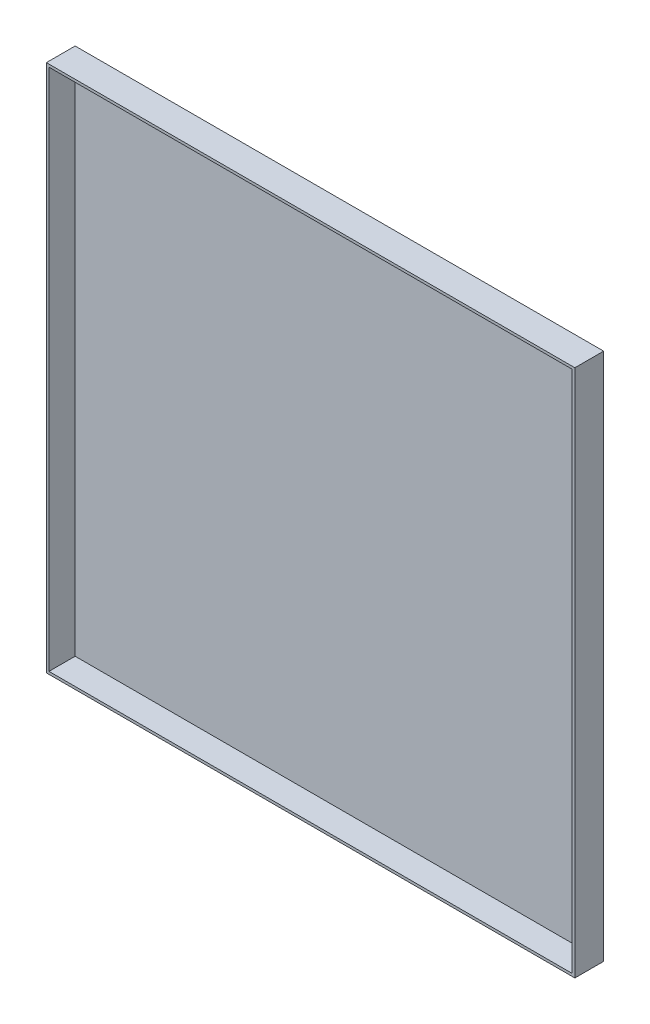
ISO-10303-21;
HEADER;
FILE_DESCRIPTION(('STEP AP214'),'2;1');
FILE_NAME('part.step','',(''),(''),'','','');
FILE_SCHEMA(('AUTOMOTIVE_DESIGN { 1 0 10303 214 1 1 1 1 }'));
ENDSEC;
DATA;
#1=APPLICATION_CONTEXT('core data for automotive mechanical design processes');
#2=APPLICATION_PROTOCOL_DEFINITION('international standard','automotive_design',2000,#1);
#3=PRODUCT_CONTEXT('',#1,'mechanical');
#4=PRODUCT('Part','Part','',(#3));
#5=PRODUCT_RELATED_PRODUCT_CATEGORY('part','',(#4));
#6=PRODUCT_DEFINITION_FORMATION('','',#4);
#7=PRODUCT_DEFINITION_CONTEXT('part definition',#1,'design');
#8=PRODUCT_DEFINITION('design','',#6,#7);
#9=PRODUCT_DEFINITION_SHAPE('','',#8);
#10=(LENGTH_UNIT() NAMED_UNIT(*) SI_UNIT(.MILLI.,.METRE.));
#11=(NAMED_UNIT(*) PLANE_ANGLE_UNIT() SI_UNIT($,.RADIAN.));
#12=(NAMED_UNIT(*) SI_UNIT($,.STERADIAN.) SOLID_ANGLE_UNIT());
#13=UNCERTAINTY_MEASURE_WITH_UNIT(LENGTH_MEASURE(1.E-05),#10,'distance_accuracy_value','');
#14=(GEOMETRIC_REPRESENTATION_CONTEXT(3) GLOBAL_UNCERTAINTY_ASSIGNED_CONTEXT((#13)) GLOBAL_UNIT_ASSIGNED_CONTEXT((#10,
#11,#12)) REPRESENTATION_CONTEXT('',''));
#15=CARTESIAN_POINT('',(0.,0.,0.));
#16=DIRECTION('',(0.,0.,1.));
#17=DIRECTION('',(1.,0.,0.));
#18=AXIS2_PLACEMENT_3D('',#15,#16,#17);
#19=CARTESIAN_POINT('',(-14.9953059608642,189.571428571429,-11.));
#20=DIRECTION('',(-1.,0.,0.));
#21=DIRECTION('',(0.,-1.,0.));
#22=AXIS2_PLACEMENT_3D('',#19,#20,#21);
#23=PLANE('',#22);
#24=DIRECTION('',(0.,-1.,0.));
#25=VECTOR('',#24,1.);
#26=CARTESIAN_POINT('',(-14.9953059608642,189.571428571429,0.));
#27=LINE('',#26,#25);
#28=CARTESIAN_POINT('',(-14.9953059608642,189.571428571429,0.));
#29=VERTEX_POINT('',#28);
#30=CARTESIAN_POINT('',(-14.9953059608641,-12.4285714285714,0.));
#31=VERTEX_POINT('',#30);
#32=EDGE_CURVE('E165',#29,#31,#27,.T.);
#33=ORIENTED_EDGE('',*,*,#32,.F.);
#34=DIRECTION('',(0.,0.,1.));
#35=VECTOR('',#34,1.);
#36=CARTESIAN_POINT('',(-14.9953059608642,189.571428571429,-11.));
#37=LINE('',#36,#35);
#38=CARTESIAN_POINT('',(-14.9953059608642,189.571428571429,-11.));
#39=VERTEX_POINT('',#38);
#40=EDGE_CURVE('E11',#39,#29,#37,.T.);
#41=ORIENTED_EDGE('',*,*,#40,.F.);
#42=DIRECTION('',(0.,-1.,0.));
#43=VECTOR('',#42,1.);
#44=CARTESIAN_POINT('',(-14.9953059608642,189.571428571429,-11.));
#45=LINE('',#44,#43);
#46=CARTESIAN_POINT('',(-14.9953059608641,-12.4285714285714,-11.));
#47=VERTEX_POINT('',#46);
#48=EDGE_CURVE('E171',#39,#47,#45,.T.);
#49=ORIENTED_EDGE('',*,*,#48,.T.);
#50=DIRECTION('',(0.,0.,1.));
#51=VECTOR('',#50,1.);
#52=CARTESIAN_POINT('',(-14.9953059608641,-12.4285714285714,-11.));
#53=LINE('',#52,#51);
#54=EDGE_CURVE('E50',#47,#31,#53,.T.);
#55=ORIENTED_EDGE('',*,*,#54,.T.);
#56=EDGE_LOOP('',(#33,#41,#49,#55));
#57=FACE_BOUND('',#56,.T.);
#58=ADVANCED_FACE('F47',(#57),#23,.T.);
#59=CARTESIAN_POINT('',(-14.9953059608642,189.571428571429,-11.));
#60=DIRECTION('',(0.,1.,0.));
#61=DIRECTION('',(0.,0.,1.));
#62=AXIS2_PLACEMENT_3D('',#59,#60,#61);
#63=PLANE('',#62);
#64=DIRECTION('',(-1.,0.,0.));
#65=VECTOR('',#64,1.);
#66=CARTESIAN_POINT('',(-14.9953059608642,189.571428571429,0.));
#67=LINE('',#66,#65);
#68=CARTESIAN_POINT('',(187.004694039136,189.571428571429,0.));
#69=VERTEX_POINT('',#68);
#70=EDGE_CURVE('E175',#69,#29,#67,.T.);
#71=ORIENTED_EDGE('',*,*,#70,.F.);
#72=DIRECTION('',(0.,0.,1.));
#73=VECTOR('',#72,1.);
#74=CARTESIAN_POINT('',(187.004694039136,189.571428571429,-11.));
#75=LINE('',#74,#73);
#76=CARTESIAN_POINT('',(187.004694039136,189.571428571429,-11.));
#77=VERTEX_POINT('',#76);
#78=EDGE_CURVE('E56',#77,#69,#75,.T.);
#79=ORIENTED_EDGE('',*,*,#78,.F.);
#80=DIRECTION('',(-1.,0.,0.));
#81=VECTOR('',#80,1.);
#82=CARTESIAN_POINT('',(-14.9953059608642,189.571428571429,-11.));
#83=LINE('',#82,#81);
#84=EDGE_CURVE('E182',#77,#39,#83,.T.);
#85=ORIENTED_EDGE('',*,*,#84,.T.);
#86=ORIENTED_EDGE('',*,*,#40,.T.);
#87=EDGE_LOOP('',(#71,#79,#85,#86));
#88=FACE_BOUND('',#87,.T.);
#89=ADVANCED_FACE('F207',(#88),#63,.T.);
#90=CARTESIAN_POINT('',(187.004694039136,189.571428571429,-11.));
#91=DIRECTION('',(1.,0.,0.));
#92=DIRECTION('',(0.,0.,-1.));
#93=AXIS2_PLACEMENT_3D('',#90,#91,#92);
#94=PLANE('',#93);
#95=DIRECTION('',(0.,1.,0.));
#96=VECTOR('',#95,1.);
#97=CARTESIAN_POINT('',(187.004694039136,189.571428571429,0.));
#98=LINE('',#97,#96);
#99=CARTESIAN_POINT('',(187.004694039136,-12.4285714285714,0.));
#100=VERTEX_POINT('',#99);
#101=EDGE_CURVE('E192',#100,#69,#98,.T.);
#102=ORIENTED_EDGE('',*,*,#101,.F.);
#103=DIRECTION('',(0.,0.,1.));
#104=VECTOR('',#103,1.);
#105=CARTESIAN_POINT('',(187.004694039136,-12.4285714285714,-11.));
#106=LINE('',#105,#104);
#107=CARTESIAN_POINT('',(187.004694039136,-12.4285714285714,-11.));
#108=VERTEX_POINT('',#107);
#109=EDGE_CURVE('E200',#108,#100,#106,.T.);
#110=ORIENTED_EDGE('',*,*,#109,.F.);
#111=DIRECTION('',(0.,1.,0.));
#112=VECTOR('',#111,1.);
#113=CARTESIAN_POINT('',(187.004694039136,189.571428571429,-11.));
#114=LINE('',#113,#112);
#115=EDGE_CURVE('E178',#108,#77,#114,.T.);
#116=ORIENTED_EDGE('',*,*,#115,.T.);
#117=ORIENTED_EDGE('',*,*,#78,.T.);
#118=EDGE_LOOP('',(#102,#110,#116,#117));
#119=FACE_BOUND('',#118,.T.);
#120=ADVANCED_FACE('F211',(#119),#94,.T.);
#121=CARTESIAN_POINT('',(-14.9953059608641,-12.4285714285714,-11.));
#122=DIRECTION('',(0.,-1.,0.));
#123=DIRECTION('',(0.,0.,-1.));
#124=AXIS2_PLACEMENT_3D('',#121,#122,#123);
#125=PLANE('',#124);
#126=DIRECTION('',(1.,0.,0.));
#127=VECTOR('',#126,1.);
#128=CARTESIAN_POINT('',(-14.9953059608641,-12.4285714285714,0.));
#129=LINE('',#128,#127);
#130=EDGE_CURVE('E188',#31,#100,#129,.T.);
#131=ORIENTED_EDGE('',*,*,#130,.F.);
#132=ORIENTED_EDGE('',*,*,#54,.F.);
#133=DIRECTION('',(1.,0.,0.));
#134=VECTOR('',#133,1.);
#135=CARTESIAN_POINT('',(-14.9953059608641,-12.4285714285714,-11.));
#136=LINE('',#135,#134);
#137=EDGE_CURVE('E174',#47,#108,#136,.T.);
#138=ORIENTED_EDGE('',*,*,#137,.T.);
#139=ORIENTED_EDGE('',*,*,#109,.T.);
#140=EDGE_LOOP('',(#131,#132,#138,#139));
#141=FACE_BOUND('',#140,.T.);
#142=ADVANCED_FACE('F204',(#141),#125,.T.);
#143=CARTESIAN_POINT('',(0.,0.,-11.));
#144=DIRECTION('',(0.,0.,1.));
#145=DIRECTION('',(1.,0.,0.));
#146=AXIS2_PLACEMENT_3D('',#143,#144,#145);
#147=PLANE('',#146);
#148=ORIENTED_EDGE('',*,*,#48,.F.);
#149=ORIENTED_EDGE('',*,*,#84,.F.);
#150=ORIENTED_EDGE('',*,*,#115,.F.);
#151=ORIENTED_EDGE('',*,*,#137,.F.);
#152=EDGE_LOOP('',(#148,#149,#150,#151));
#153=FACE_BOUND('',#152,.T.);
#154=ADVANCED_FACE('F213',(#153),#147,.F.);
#155=CARTESIAN_POINT('',(0.,0.,0.));
#156=DIRECTION('',(0.,0.,1.));
#157=DIRECTION('',(1.,0.,0.));
#158=AXIS2_PLACEMENT_3D('',#155,#156,#157);
#159=PLANE('',#158);
#160=DIRECTION('',(0.,-1.,0.));
#161=VECTOR('',#160,1.);
#162=CARTESIAN_POINT('',(-13.9953059608642,188.571428571429,0.));
#163=LINE('',#162,#161);
#164=CARTESIAN_POINT('',(-13.9953059608642,188.571428571429,0.));
#165=VERTEX_POINT('',#164);
#166=CARTESIAN_POINT('',(-13.9953059608642,-11.4285714285714,0.));
#167=VERTEX_POINT('',#166);
#168=EDGE_CURVE('E64',#165,#167,#163,.T.);
#169=ORIENTED_EDGE('',*,*,#168,.F.);
#170=DIRECTION('',(-1.,0.,0.));
#171=VECTOR('',#170,1.);
#172=CARTESIAN_POINT('',(-13.9953059608642,188.571428571429,0.));
#173=LINE('',#172,#171);
#174=CARTESIAN_POINT('',(186.004694039136,188.571428571429,0.));
#175=VERTEX_POINT('',#174);
#176=EDGE_CURVE('E143',#175,#165,#173,.T.);
#177=ORIENTED_EDGE('',*,*,#176,.F.);
#178=DIRECTION('',(0.,1.,0.));
#179=VECTOR('',#178,1.);
#180=CARTESIAN_POINT('',(186.004694039136,188.571428571429,0.));
#181=LINE('',#180,#179);
#182=CARTESIAN_POINT('',(186.004694039136,-11.4285714285714,0.));
#183=VERTEX_POINT('',#182);
#184=EDGE_CURVE('E147',#183,#175,#181,.T.);
#185=ORIENTED_EDGE('',*,*,#184,.F.);
#186=DIRECTION('',(1.,0.,0.));
#187=VECTOR('',#186,1.);
#188=CARTESIAN_POINT('',(-13.9953059608642,-11.4285714285714,0.));
#189=LINE('',#188,#187);
#190=EDGE_CURVE('E156',#167,#183,#189,.T.);
#191=ORIENTED_EDGE('',*,*,#190,.F.);
#192=EDGE_LOOP('',(#169,#177,#185,#191));
#193=FACE_BOUND('',#192,.T.);
#194=ORIENTED_EDGE('',*,*,#32,.T.);
#195=ORIENTED_EDGE('',*,*,#130,.T.);
#196=ORIENTED_EDGE('',*,*,#101,.T.);
#197=ORIENTED_EDGE('',*,*,#70,.T.);
#198=EDGE_LOOP('',(#194,#195,#196,#197));
#199=FACE_BOUND('',#198,.T.);
#200=ADVANCED_FACE('F206',(#193,#199),#159,.T.);
#201=CARTESIAN_POINT('',(-13.9953059608642,188.571428571429,-10.));
#202=DIRECTION('',(-1.,0.,0.));
#203=DIRECTION('',(0.,-1.,0.));
#204=AXIS2_PLACEMENT_3D('',#201,#202,#203);
#205=PLANE('',#204);
#206=ORIENTED_EDGE('',*,*,#168,.T.);
#207=DIRECTION('',(0.,0.,1.));
#208=VECTOR('',#207,1.);
#209=CARTESIAN_POINT('',(-13.9953059608642,-11.4285714285714,-10.));
#210=LINE('',#209,#208);
#211=CARTESIAN_POINT('',(-13.9953059608642,-11.4285714285714,-10.));
#212=VERTEX_POINT('',#211);
#213=EDGE_CURVE('E118',#212,#167,#210,.T.);
#214=ORIENTED_EDGE('',*,*,#213,.F.);
#215=DIRECTION('',(0.,-1.,0.));
#216=VECTOR('',#215,1.);
#217=CARTESIAN_POINT('',(-13.9953059608642,188.571428571429,-10.));
#218=LINE('',#217,#216);
#219=CARTESIAN_POINT('',(-13.9953059608642,188.571428571429,-10.));
#220=VERTEX_POINT('',#219);
#221=EDGE_CURVE('E122',#220,#212,#218,.T.);
#222=ORIENTED_EDGE('',*,*,#221,.F.);
#223=DIRECTION('',(0.,0.,1.));
#224=VECTOR('',#223,1.);
#225=CARTESIAN_POINT('',(-13.9953059608642,188.571428571429,-10.));
#226=LINE('',#225,#224);
#227=EDGE_CURVE('E162',#220,#165,#226,.T.);
#228=ORIENTED_EDGE('',*,*,#227,.T.);
#229=EDGE_LOOP('',(#206,#214,#222,#228));
#230=FACE_BOUND('',#229,.T.);
#231=ADVANCED_FACE('F120',(#230),#205,.F.);
#232=CARTESIAN_POINT('',(-13.9953059608642,188.571428571429,-10.));
#233=DIRECTION('',(0.,1.,0.));
#234=DIRECTION('',(0.,0.,1.));
#235=AXIS2_PLACEMENT_3D('',#232,#233,#234);
#236=PLANE('',#235);
#237=ORIENTED_EDGE('',*,*,#176,.T.);
#238=ORIENTED_EDGE('',*,*,#227,.F.);
#239=DIRECTION('',(-1.,0.,0.));
#240=VECTOR('',#239,1.);
#241=CARTESIAN_POINT('',(-13.9953059608642,188.571428571429,-10.));
#242=LINE('',#241,#240);
#243=CARTESIAN_POINT('',(186.004694039136,188.571428571429,-10.));
#244=VERTEX_POINT('',#243);
#245=EDGE_CURVE('E129',#244,#220,#242,.T.);
#246=ORIENTED_EDGE('',*,*,#245,.F.);
#247=DIRECTION('',(0.,0.,1.));
#248=VECTOR('',#247,1.);
#249=CARTESIAN_POINT('',(186.004694039136,188.571428571429,-10.));
#250=LINE('',#249,#248);
#251=EDGE_CURVE('E166',#244,#175,#250,.T.);
#252=ORIENTED_EDGE('',*,*,#251,.T.);
#253=EDGE_LOOP('',(#237,#238,#246,#252));
#254=FACE_BOUND('',#253,.T.);
#255=ADVANCED_FACE('F264',(#254),#236,.F.);
#256=CARTESIAN_POINT('',(186.004694039136,188.571428571429,-10.));
#257=DIRECTION('',(1.,0.,0.));
#258=DIRECTION('',(0.,0.,-1.));
#259=AXIS2_PLACEMENT_3D('',#256,#257,#258);
#260=PLANE('',#259);
#261=ORIENTED_EDGE('',*,*,#184,.T.);
#262=ORIENTED_EDGE('',*,*,#251,.F.);
#263=DIRECTION('',(0.,1.,0.));
#264=VECTOR('',#263,1.);
#265=CARTESIAN_POINT('',(186.004694039136,188.571428571429,-10.));
#266=LINE('',#265,#264);
#267=CARTESIAN_POINT('',(186.004694039136,-11.4285714285714,-10.));
#268=VERTEX_POINT('',#267);
#269=EDGE_CURVE('E138',#268,#244,#266,.T.);
#270=ORIENTED_EDGE('',*,*,#269,.F.);
#271=DIRECTION('',(0.,0.,1.));
#272=VECTOR('',#271,1.);
#273=CARTESIAN_POINT('',(186.004694039136,-11.4285714285714,-10.));
#274=LINE('',#273,#272);
#275=EDGE_CURVE('E128',#268,#183,#274,.T.);
#276=ORIENTED_EDGE('',*,*,#275,.T.);
#277=EDGE_LOOP('',(#261,#262,#270,#276));
#278=FACE_BOUND('',#277,.T.);
#279=ADVANCED_FACE('F271',(#278),#260,.F.);
#280=CARTESIAN_POINT('',(-13.9953059608642,-11.4285714285714,-10.));
#281=DIRECTION('',(0.,-1.,0.));
#282=DIRECTION('',(0.,0.,-1.));
#283=AXIS2_PLACEMENT_3D('',#280,#281,#282);
#284=PLANE('',#283);
#285=ORIENTED_EDGE('',*,*,#190,.T.);
#286=ORIENTED_EDGE('',*,*,#275,.F.);
#287=DIRECTION('',(1.,0.,0.));
#288=VECTOR('',#287,1.);
#289=CARTESIAN_POINT('',(-13.9953059608642,-11.4285714285714,-10.));
#290=LINE('',#289,#288);
#291=EDGE_CURVE('E132',#212,#268,#290,.T.);
#292=ORIENTED_EDGE('',*,*,#291,.F.);
#293=ORIENTED_EDGE('',*,*,#213,.T.);
#294=EDGE_LOOP('',(#285,#286,#292,#293));
#295=FACE_BOUND('',#294,.T.);
#296=ADVANCED_FACE('F133',(#295),#284,.F.);
#297=CARTESIAN_POINT('',(0.,0.,-10.));
#298=DIRECTION('',(0.,0.,1.));
#299=DIRECTION('',(1.,0.,0.));
#300=AXIS2_PLACEMENT_3D('',#297,#298,#299);
#301=PLANE('',#300);
#302=ORIENTED_EDGE('',*,*,#221,.T.);
#303=ORIENTED_EDGE('',*,*,#291,.T.);
#304=ORIENTED_EDGE('',*,*,#269,.T.);
#305=ORIENTED_EDGE('',*,*,#245,.T.);
#306=EDGE_LOOP('',(#302,#303,#304,#305));
#307=FACE_BOUND('',#306,.T.);
#308=ADVANCED_FACE('F140',(#307),#301,.T.);
#309=CLOSED_SHELL('',(#58,#89,#120,#142,#154,#200,#231,#255,#279,#296,#308));
#310=MANIFOLD_SOLID_BREP('B2',#309);
#311=ADVANCED_BREP_SHAPE_REPRESENTATION('',(#18,#310),#14);
#312=SHAPE_DEFINITION_REPRESENTATION(#9,#311);
ENDSEC;
END-ISO-10303-21;
